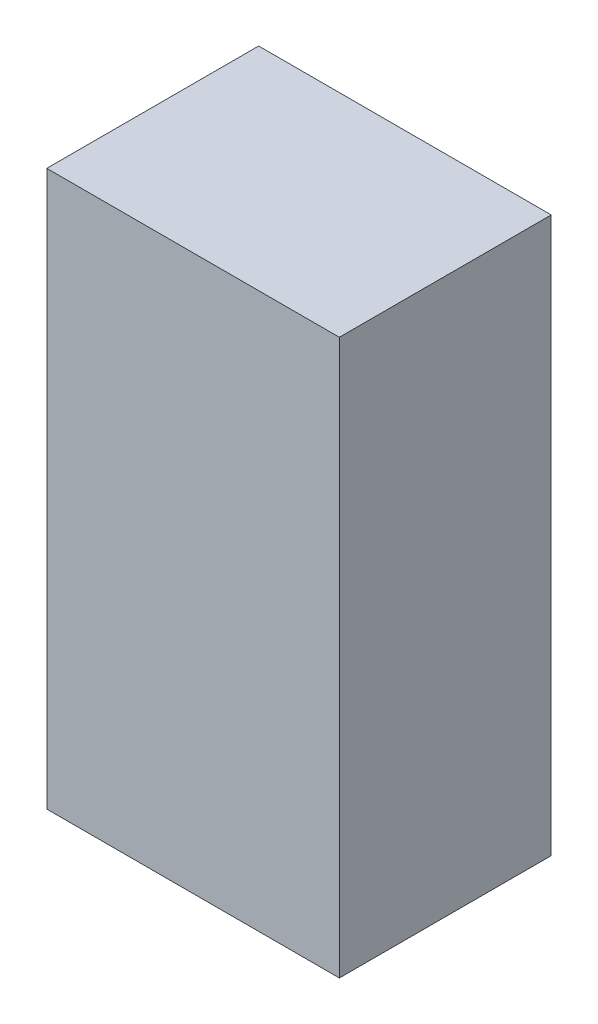
ISO-10303-21;
HEADER;
FILE_DESCRIPTION(('STEP AP214'),'2;1');
FILE_NAME('part.step','',(''),(''),'','','');
FILE_SCHEMA(('AUTOMOTIVE_DESIGN { 1 0 10303 214 1 1 1 1 }'));
ENDSEC;
DATA;
#1=APPLICATION_CONTEXT('core data for automotive mechanical design processes');
#2=APPLICATION_PROTOCOL_DEFINITION('international standard','automotive_design',2000,#1);
#3=PRODUCT_CONTEXT('',#1,'mechanical');
#4=PRODUCT('Part','Part','',(#3));
#5=PRODUCT_RELATED_PRODUCT_CATEGORY('part','',(#4));
#6=PRODUCT_DEFINITION_FORMATION('','',#4);
#7=PRODUCT_DEFINITION_CONTEXT('part definition',#1,'design');
#8=PRODUCT_DEFINITION('design','',#6,#7);
#9=PRODUCT_DEFINITION_SHAPE('','',#8);
#10=(LENGTH_UNIT() NAMED_UNIT(*) SI_UNIT(.MILLI.,.METRE.));
#11=(NAMED_UNIT(*) PLANE_ANGLE_UNIT() SI_UNIT($,.RADIAN.));
#12=(NAMED_UNIT(*) SI_UNIT($,.STERADIAN.) SOLID_ANGLE_UNIT());
#13=UNCERTAINTY_MEASURE_WITH_UNIT(LENGTH_MEASURE(1.E-05),#10,'distance_accuracy_value','');
#14=(GEOMETRIC_REPRESENTATION_CONTEXT(3) GLOBAL_UNCERTAINTY_ASSIGNED_CONTEXT((#13)) GLOBAL_UNIT_ASSIGNED_CONTEXT((#10,
#11,#12)) REPRESENTATION_CONTEXT('',''));
#15=CARTESIAN_POINT('',(0.,0.,0.));
#16=DIRECTION('',(0.,0.,1.));
#17=DIRECTION('',(1.,0.,0.));
#18=AXIS2_PLACEMENT_3D('',#15,#16,#17);
#19=CARTESIAN_POINT('',(-0.72499982,1.37500106,1.05000044));
#20=DIRECTION('',(0.,0.,-1.));
#21=DIRECTION('',(0.,-1.,0.));
#22=AXIS2_PLACEMENT_3D('',#19,#20,#21);
#23=PLANE('',#22);
#24=DIRECTION('',(0.,-1.,0.));
#25=VECTOR('',#24,1.);
#26=CARTESIAN_POINT('',(-0.72499982,1.37500106,1.05000044));
#27=LINE('',#26,#25);
#28=CARTESIAN_POINT('',(-0.72499982,1.37500106,1.05000044));
#29=VERTEX_POINT('',#28);
#30=CARTESIAN_POINT('',(-0.72499982,-1.37499852,1.05000044));
#31=VERTEX_POINT('',#30);
#32=EDGE_CURVE('E79',#29,#31,#27,.T.);
#33=ORIENTED_EDGE('',*,*,#32,.T.);
#34=DIRECTION('',(1.,0.,0.));
#35=VECTOR('',#34,1.);
#36=CARTESIAN_POINT('',(-0.72499982,-1.37499852,1.05000044));
#37=LINE('',#36,#35);
#38=CARTESIAN_POINT('',(0.72499982,-1.37499852,1.05000044));
#39=VERTEX_POINT('',#38);
#40=EDGE_CURVE('E20',#31,#39,#37,.T.);
#41=ORIENTED_EDGE('',*,*,#40,.T.);
#42=DIRECTION('',(0.,1.,0.));
#43=VECTOR('',#42,1.);
#44=CARTESIAN_POINT('',(0.72499982,-1.37499852,1.05000044));
#45=LINE('',#44,#43);
#46=CARTESIAN_POINT('',(0.72499982,1.37500106,1.05000044));
#47=VERTEX_POINT('',#46);
#48=EDGE_CURVE('E101',#39,#47,#45,.T.);
#49=ORIENTED_EDGE('',*,*,#48,.T.);
#50=DIRECTION('',(-1.,0.,0.));
#51=VECTOR('',#50,1.);
#52=CARTESIAN_POINT('',(0.72499982,1.37500106,1.05000044));
#53=LINE('',#52,#51);
#54=EDGE_CURVE('E11',#47,#29,#53,.T.);
#55=ORIENTED_EDGE('',*,*,#54,.T.);
#56=EDGE_LOOP('',(#33,#41,#49,#55));
#57=FACE_BOUND('',#56,.T.);
#58=ADVANCED_FACE('F16',(#57),#23,.F.);
#59=CARTESIAN_POINT('',(-0.72499982,1.37500106,0.));
#60=DIRECTION('',(0.,0.,-1.));
#61=DIRECTION('',(0.,-1.,0.));
#62=AXIS2_PLACEMENT_3D('',#59,#60,#61);
#63=PLANE('',#62);
#64=DIRECTION('',(-1.,0.,0.));
#65=VECTOR('',#64,1.);
#66=CARTESIAN_POINT('',(0.72499982,1.37500106,0.));
#67=LINE('',#66,#65);
#68=CARTESIAN_POINT('',(0.72499982,1.37500106,0.));
#69=VERTEX_POINT('',#68);
#70=CARTESIAN_POINT('',(-0.72499982,1.37500106,0.));
#71=VERTEX_POINT('',#70);
#72=EDGE_CURVE('E27',#69,#71,#67,.T.);
#73=ORIENTED_EDGE('',*,*,#72,.F.);
#74=DIRECTION('',(0.,1.,0.));
#75=VECTOR('',#74,1.);
#76=CARTESIAN_POINT('',(0.72499982,-1.37499852,0.));
#77=LINE('',#76,#75);
#78=CARTESIAN_POINT('',(0.72499982,-1.37499852,0.));
#79=VERTEX_POINT('',#78);
#80=EDGE_CURVE('E77',#79,#69,#77,.T.);
#81=ORIENTED_EDGE('',*,*,#80,.F.);
#82=DIRECTION('',(1.,0.,0.));
#83=VECTOR('',#82,1.);
#84=CARTESIAN_POINT('',(-0.72499982,-1.37499852,0.));
#85=LINE('',#84,#83);
#86=CARTESIAN_POINT('',(-0.72499982,-1.37499852,0.));
#87=VERTEX_POINT('',#86);
#88=EDGE_CURVE('E104',#87,#79,#85,.T.);
#89=ORIENTED_EDGE('',*,*,#88,.F.);
#90=DIRECTION('',(0.,-1.,0.));
#91=VECTOR('',#90,1.);
#92=CARTESIAN_POINT('',(-0.72499982,1.37500106,0.));
#93=LINE('',#92,#91);
#94=EDGE_CURVE('E87',#71,#87,#93,.T.);
#95=ORIENTED_EDGE('',*,*,#94,.F.);
#96=EDGE_LOOP('',(#73,#81,#89,#95));
#97=FACE_BOUND('',#96,.T.);
#98=ADVANCED_FACE('F114',(#97),#63,.T.);
#99=CARTESIAN_POINT('',(0.72499982,1.37500106,0.));
#100=DIRECTION('',(0.,-1.,0.));
#101=DIRECTION('',(0.,0.,-1.));
#102=AXIS2_PLACEMENT_3D('',#99,#100,#101);
#103=PLANE('',#102);
#104=ORIENTED_EDGE('',*,*,#72,.T.);
#105=DIRECTION('',(0.,0.,1.));
#106=VECTOR('',#105,1.);
#107=CARTESIAN_POINT('',(-0.72499982,1.37500106,0.));
#108=LINE('',#107,#106);
#109=EDGE_CURVE('E83',#71,#29,#108,.T.);
#110=ORIENTED_EDGE('',*,*,#109,.T.);
#111=ORIENTED_EDGE('',*,*,#54,.F.);
#112=DIRECTION('',(0.,0.,1.));
#113=VECTOR('',#112,1.);
#114=CARTESIAN_POINT('',(0.72499982,1.37500106,0.));
#115=LINE('',#114,#113);
#116=EDGE_CURVE('E97',#69,#47,#115,.T.);
#117=ORIENTED_EDGE('',*,*,#116,.F.);
#118=EDGE_LOOP('',(#104,#110,#111,#117));
#119=FACE_BOUND('',#118,.T.);
#120=ADVANCED_FACE('F18',(#119),#103,.F.);
#121=CARTESIAN_POINT('',(0.72499982,-1.37499852,0.));
#122=DIRECTION('',(-1.,0.,0.));
#123=DIRECTION('',(0.,0.,1.));
#124=AXIS2_PLACEMENT_3D('',#121,#122,#123);
#125=PLANE('',#124);
#126=ORIENTED_EDGE('',*,*,#80,.T.);
#127=ORIENTED_EDGE('',*,*,#116,.T.);
#128=ORIENTED_EDGE('',*,*,#48,.F.);
#129=DIRECTION('',(0.,0.,1.));
#130=VECTOR('',#129,1.);
#131=CARTESIAN_POINT('',(0.72499982,-1.37499852,0.));
#132=LINE('',#131,#130);
#133=EDGE_CURVE('E74',#79,#39,#132,.T.);
#134=ORIENTED_EDGE('',*,*,#133,.F.);
#135=EDGE_LOOP('',(#126,#127,#128,#134));
#136=FACE_BOUND('',#135,.T.);
#137=ADVANCED_FACE('F151',(#136),#125,.F.);
#138=CARTESIAN_POINT('',(-0.72499982,-1.37499852,0.));
#139=DIRECTION('',(0.,1.,0.));
#140=DIRECTION('',(1.,0.,0.));
#141=AXIS2_PLACEMENT_3D('',#138,#139,#140);
#142=PLANE('',#141);
#143=ORIENTED_EDGE('',*,*,#88,.T.);
#144=ORIENTED_EDGE('',*,*,#133,.T.);
#145=ORIENTED_EDGE('',*,*,#40,.F.);
#146=DIRECTION('',(0.,0.,1.));
#147=VECTOR('',#146,1.);
#148=CARTESIAN_POINT('',(-0.72499982,-1.37499852,0.));
#149=LINE('',#148,#147);
#150=EDGE_CURVE('E71',#87,#31,#149,.T.);
#151=ORIENTED_EDGE('',*,*,#150,.F.);
#152=EDGE_LOOP('',(#143,#144,#145,#151));
#153=FACE_BOUND('',#152,.T.);
#154=ADVANCED_FACE('F69',(#153),#142,.F.);
#155=CARTESIAN_POINT('',(-0.72499982,1.37500106,0.));
#156=DIRECTION('',(1.,0.,0.));
#157=DIRECTION('',(0.,1.,0.));
#158=AXIS2_PLACEMENT_3D('',#155,#156,#157);
#159=PLANE('',#158);
#160=ORIENTED_EDGE('',*,*,#94,.T.);
#161=ORIENTED_EDGE('',*,*,#150,.T.);
#162=ORIENTED_EDGE('',*,*,#32,.F.);
#163=ORIENTED_EDGE('',*,*,#109,.F.);
#164=EDGE_LOOP('',(#160,#161,#162,#163));
#165=FACE_BOUND('',#164,.T.);
#166=ADVANCED_FACE('F85',(#165),#159,.F.);
#167=CLOSED_SHELL('',(#58,#98,#120,#137,#154,#166));
#168=MANIFOLD_SOLID_BREP('B1',#167);
#169=ADVANCED_BREP_SHAPE_REPRESENTATION('',(#18,#168),#14);
#170=SHAPE_DEFINITION_REPRESENTATION(#9,#169);
ENDSEC;
END-ISO-10303-21;
